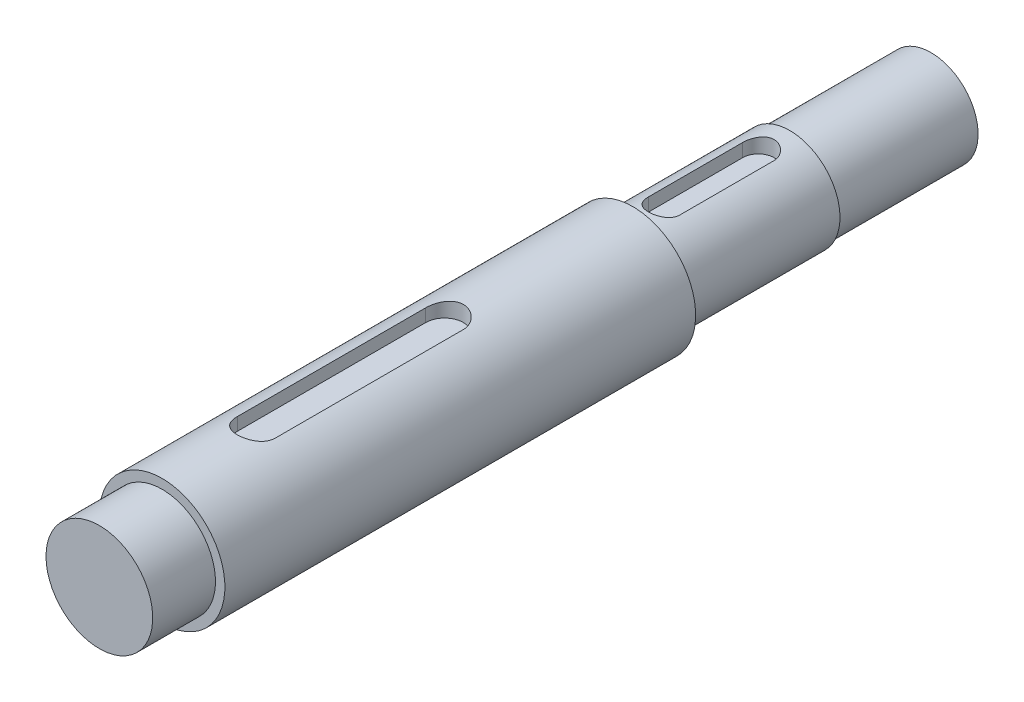
ISO-10303-21;
HEADER;
FILE_DESCRIPTION(('STEP AP214'),'2;1');
FILE_NAME('part.step','',(''),(''),'','','');
FILE_SCHEMA(('AUTOMOTIVE_DESIGN { 1 0 10303 214 1 1 1 1 }'));
ENDSEC;
DATA;
#1=APPLICATION_CONTEXT('core data for automotive mechanical design processes');
#2=APPLICATION_PROTOCOL_DEFINITION('international standard','automotive_design',2000,#1);
#3=PRODUCT_CONTEXT('',#1,'mechanical');
#4=PRODUCT('Part','Part','',(#3));
#5=PRODUCT_RELATED_PRODUCT_CATEGORY('part','',(#4));
#6=PRODUCT_DEFINITION_FORMATION('','',#4);
#7=PRODUCT_DEFINITION_CONTEXT('part definition',#1,'design');
#8=PRODUCT_DEFINITION('design','',#6,#7);
#9=PRODUCT_DEFINITION_SHAPE('','',#8);
#10=(LENGTH_UNIT() NAMED_UNIT(*) SI_UNIT(.MILLI.,.METRE.));
#11=(NAMED_UNIT(*) PLANE_ANGLE_UNIT() SI_UNIT($,.RADIAN.));
#12=(NAMED_UNIT(*) SI_UNIT($,.STERADIAN.) SOLID_ANGLE_UNIT());
#13=UNCERTAINTY_MEASURE_WITH_UNIT(LENGTH_MEASURE(1.E-05),#10,'distance_accuracy_value','');
#14=(GEOMETRIC_REPRESENTATION_CONTEXT(3) GLOBAL_UNCERTAINTY_ASSIGNED_CONTEXT((#13)) GLOBAL_UNIT_ASSIGNED_CONTEXT((#10,
#11,#12)) REPRESENTATION_CONTEXT('',''));
#15=CARTESIAN_POINT('',(0.,0.,0.));
#16=DIRECTION('',(0.,0.,1.));
#17=DIRECTION('',(1.,0.,0.));
#18=AXIS2_PLACEMENT_3D('',#15,#16,#17);
#19=CARTESIAN_POINT('',(0.,0.,0.));
#20=DIRECTION('',(0.,0.,-1.));
#21=DIRECTION('',(-1.,0.,0.));
#22=AXIS2_PLACEMENT_3D('',#19,#20,#21);
#23=CYLINDRICAL_SURFACE('',#22,20.);
#24=CARTESIAN_POINT('',(0.,0.,95.));
#25=DIRECTION('',(0.,0.,-1.));
#26=DIRECTION('',(-1.,0.,0.));
#27=AXIS2_PLACEMENT_3D('',#24,#25,#26);
#28=CIRCLE('',#27,20.);
#29=CARTESIAN_POINT('',(-20.,0.,95.));
#30=VERTEX_POINT('',#29);
#31=EDGE_CURVE('E162',#30,#30,#28,.T.);
#32=ORIENTED_EDGE('',*,*,#31,.F.);
#33=EDGE_LOOP('',(#32));
#34=FACE_BOUND('',#33,.T.);
#35=CARTESIAN_POINT('',(0.,0.,245.));
#36=DIRECTION('',(0.,0.,-1.));
#37=DIRECTION('',(-1.,0.,0.));
#38=AXIS2_PLACEMENT_3D('',#35,#36,#37);
#39=CIRCLE('',#38,20.);
#40=CARTESIAN_POINT('',(-20.,0.,245.));
#41=VERTEX_POINT('',#40);
#42=EDGE_CURVE('E165',#41,#41,#39,.T.);
#43=ORIENTED_EDGE('',*,*,#42,.T.);
#44=EDGE_LOOP('',(#43));
#45=FACE_BOUND('',#44,.T.);
#46=CARTESIAN_POINT('',(6.00000000000017,19.0787840283389,155.));
#47=CARTESIAN_POINT('',(6.00002230630971,19.0787603919218,154.835332005089));
#48=CARTESIAN_POINT('',(5.99322212828878,19.0809150948053,154.67067261307));
#49=CARTESIAN_POINT('',(5.96614198358455,19.089408588524,154.342610571615));
#50=CARTESIAN_POINT('',(5.94586504749999,19.0957464386677,154.179207647986));
#51=CARTESIAN_POINT('',(5.89206455668675,19.1124126760414,153.855233206316));
#52=CARTESIAN_POINT('',(5.85857463708954,19.1227309292375,153.694655572036));
#53=CARTESIAN_POINT('',(5.77865096251394,19.1470349488515,153.377037691332));
#54=CARTESIAN_POINT('',(5.73221686903448,19.16102081118,153.219997537531));
#55=CARTESIAN_POINT('',(5.62682620459501,19.1922338155173,152.910617439276));
#56=CARTESIAN_POINT('',(5.5678770245257,19.2094590438082,152.758274781224));
#57=CARTESIAN_POINT('',(5.43788252899642,19.2466621419291,152.459125857098));
#58=CARTESIAN_POINT('',(5.36683271334074,19.2666410353108,152.312321675672));
#59=CARTESIAN_POINT('',(5.21317247195212,19.3087849542851,152.025215054747));
#60=CARTESIAN_POINT('',(5.1305613960985,19.3309501027959,151.88491298147));
#61=CARTESIAN_POINT('',(4.95431913401991,19.3768680311909,151.611612201325));
#62=CARTESIAN_POINT('',(4.86068378223789,19.4006214097184,151.478616283128));
#63=CARTESIAN_POINT('',(4.66024014290241,19.4497584548899,151.21713642677));
#64=CARTESIAN_POINT('',(4.55313526362707,19.4751691904068,151.088884847802));
#65=CARTESIAN_POINT('',(4.32860344600283,19.5263015189751,150.841746062991));
#66=CARTESIAN_POINT('',(4.21117292654735,19.5520232171847,150.722862133329));
#67=CARTESIAN_POINT('',(3.96676059198608,19.6030710031715,150.495258604878));
#68=CARTESIAN_POINT('',(3.83977871873954,19.6283970885393,150.386539067971));
#69=CARTESIAN_POINT('',(3.57705696576226,19.6779706962222,150.179980745528));
#70=CARTESIAN_POINT('',(3.44131715512985,19.7022182270443,150.082141874161));
#71=CARTESIAN_POINT('',(3.15899953964094,19.7494715734221,149.89609023174));
#72=CARTESIAN_POINT('',(3.01225429870671,19.7724407517412,149.808121953698));
#73=CARTESIAN_POINT('',(2.71155717798069,19.8159158974823,149.644936205945));
#74=CARTESIAN_POINT('',(2.55760798995113,19.8364227748921,149.569714021433));
#75=CARTESIAN_POINT('',(2.24348996032498,19.8744001644265,149.432583560629));
#76=CARTESIAN_POINT('',(2.08331997555635,19.8918701152059,149.370677745232));
#77=CARTESIAN_POINT('',(1.75801430484789,19.923254535561,149.260762497544));
#78=CARTESIAN_POINT('',(1.59288079897405,19.9371705413066,149.212747060032));
#79=CARTESIAN_POINT('',(1.26354510595591,19.960709769643,149.132174453272));
#80=CARTESIAN_POINT('',(1.09944808925095,19.9704430293701,149.099219373042));
#81=CARTESIAN_POINT('',(0.768952154149116,19.9858966495547,149.047128002714));
#82=CARTESIAN_POINT('',(0.602554181799461,19.9916186120195,149.027986195865));
#83=CARTESIAN_POINT('',(0.268644299740396,19.9988929276978,149.003680035143));
#84=CARTESIAN_POINT('',(0.101132356361144,20.0004451543013,148.998516105694));
#85=CARTESIAN_POINT('',(-0.23372090041069,19.9993350985709,149.002216405078));
#86=CARTESIAN_POINT('',(-0.401062216878332,19.9966728935832,149.011080376463));
#87=CARTESIAN_POINT('',(-0.728949940400138,19.9873626800315,149.042242211602));
#88=CARTESIAN_POINT('',(-0.889542117296485,19.9808452710305,149.064100009983));
#89=CARTESIAN_POINT('',(-1.20830021014889,19.9641050678088,149.120695481758));
#90=CARTESIAN_POINT('',(-1.36646528055398,19.9538810115069,149.155437542225));
#91=CARTESIAN_POINT('',(-1.67917461818921,19.9300014175933,149.23749230161));
#92=CARTESIAN_POINT('',(-1.83372008335715,19.916347033335,149.284800775723));
#93=CARTESIAN_POINT('',(-2.13828018933718,19.8859545815151,149.391630271063));
#94=CARTESIAN_POINT('',(-2.28829310223854,19.8692153547843,149.451155883997));
#95=CARTESIAN_POINT('',(-2.58443507880925,19.8328818557961,149.582690579539));
#96=CARTESIAN_POINT('',(-2.73050124822103,19.8132575095083,149.654832897198));
#97=CARTESIAN_POINT('',(-3.01609632375403,19.7717979578185,149.810623147329));
#98=CARTESIAN_POINT('',(-3.15562296424223,19.7499619943592,149.894275028384));
#99=CARTESIAN_POINT('',(-3.42724384686874,19.704643118031,150.072486982441));
#100=CARTESIAN_POINT('',(-3.55933800314009,19.681160186142,150.167047181428));
#101=CARTESIAN_POINT('',(-3.81531376455338,19.6331439703208,150.366458678429));
#102=CARTESIAN_POINT('',(-3.93919513006467,19.6086106557752,150.471310276501));
#103=CARTESIAN_POINT('',(-4.18263653591635,19.5581593507452,150.694897243463));
#104=CARTESIAN_POINT('',(-4.30184428600917,19.5322244988475,150.814012679474));
#105=CARTESIAN_POINT('',(-4.52981041510251,19.4806179410543,151.061833503502));
#106=CARTESIAN_POINT('',(-4.63857214120799,19.4549461532391,151.190535796081));
#107=CARTESIAN_POINT('',(-4.84504126060948,19.4045581786368,151.456840396238));
#108=CARTESIAN_POINT('',(-4.94274124635215,19.3798426394128,151.594448571901));
#109=CARTESIAN_POINT('',(-5.12628631686307,19.3321023379675,151.877559092333));
#110=CARTESIAN_POINT('',(-5.21213600998861,19.3090769201298,152.023058337578));
#111=CARTESIAN_POINT('',(-5.3722308036755,19.2651525602886,152.322635135093));
#112=CARTESIAN_POINT('',(-5.44634371437385,19.2442786555292,152.476787078659));
#113=CARTESIAN_POINT('',(-5.58122691640486,19.205593723789,152.791121841361));
#114=CARTESIAN_POINT('',(-5.64200266456187,19.1877814448102,152.951302162478));
#115=CARTESIAN_POINT('',(-5.74966145349615,19.1557967477957,153.27643211835));
#116=CARTESIAN_POINT('',(-5.7965591282547,19.1416204978024,153.441376526563));
#117=CARTESIAN_POINT('',(-5.87609462586421,19.1173543231183,153.774893180451));
#118=CARTESIAN_POINT('',(-5.9087390260436,19.1072625137755,153.943463715048));
#119=CARTESIAN_POINT('',(-5.95603131732384,19.0925703406669,154.259937070236));
#120=CARTESIAN_POINT('',(-5.97251971262409,19.0874107715083,154.40754170936));
#121=CARTESIAN_POINT('',(-5.99450261914139,19.0805126306353,154.703427112475));
#122=CARTESIAN_POINT('',(-6.00001329545491,19.0787690288454,154.851706559575));
#123=CARTESIAN_POINT('',(-5.99999999999983,19.078784028339,155.));
#124=B_SPLINE_CURVE_WITH_KNOTS('',3,(#46,#47,#48,#49,#50,#51,#52,#53,#54,#55,#56,#57,#58,#59,
#60,#61,#62,#63,#64,#65,#66,#67,#68,#69,#70,#71,#72,#73,#74,#75,#76,#77,#78,#79,#80,#81,#82,#83,
#84,#85,#86,#87,#88,#89,#90,#91,#92,#93,#94,#95,#96,#97,#98,#99,#100,#101,#102,#103,#104,#105,
#106,#107,#108,#109,#110,#111,#112,#113,#114,#115,#116,#117,#118,#119,#120,#121,#122,#123),
.UNSPECIFIED.,.F.,.F.,(4,2,2,2,2,2,2,2,2,2,2,2,2,2,2,2,2,2,2,2,2,2,2,2,2,2,2,2,2,2,2,2,2,2,2,2,
2,2,4),(0.,0.493836284878976,0.987561555412216,1.48003801924605,1.97252736296405,
2.46472666795178,2.95710942192586,3.44951987503682,3.94211698773,4.44857898474592,
4.95521732942468,5.46185875834847,5.96849619046396,6.48574341264193,7.00279888450885,
7.51994982748061,8.03687685551445,8.53921958328379,9.04136157401789,9.5435188116382,
10.0456668334346,10.531706521874,11.0179118582603,11.5039539397552,11.9901790315928,
12.4818885441265,12.9737671698834,13.4656514771114,13.9575501300996,14.4684682486943,
14.9792221093922,15.4903160010787,16.001210574562,16.5175029344931,17.0335836608614,
17.549118241575,18.0644146711719,18.509813123396,18.9545552237083),.UNSPECIFIED.);
#125=CARTESIAN_POINT('',(6.00000000000017,19.0787840283389,155.));
#126=VERTEX_POINT('',#125);
#127=CARTESIAN_POINT('',(-5.99999999999983,19.078784028339,155.));
#128=VERTEX_POINT('',#127);
#129=EDGE_CURVE('E214',#126,#128,#124,.T.);
#130=ORIENTED_EDGE('',*,*,#129,.F.);
#131=DIRECTION('',(0.,0.,-1.));
#132=VECTOR('',#131,1.);
#133=CARTESIAN_POINT('',(6.00000000000017,19.0787840283389,0.));
#134=LINE('',#133,#132);
#135=CARTESIAN_POINT('',(6.00000000000017,19.0787840283389,215.));
#136=VERTEX_POINT('',#135);
#137=EDGE_CURVE('E11',#136,#126,#134,.T.);
#138=ORIENTED_EDGE('',*,*,#137,.F.);
#139=CARTESIAN_POINT('',(-5.99999999999983,19.078784028339,215.));
#140=CARTESIAN_POINT('',(-6.00002230630936,19.0787603919219,215.164667994911));
#141=CARTESIAN_POINT('',(-5.99322212828844,19.0809150948054,215.32932738693));
#142=CARTESIAN_POINT('',(-5.96614198358421,19.0894085885241,215.657389428385));
#143=CARTESIAN_POINT('',(-5.94586504749965,19.0957464386678,215.820792352014));
#144=CARTESIAN_POINT('',(-5.89206455668642,19.1124126760415,216.144766793684));
#145=CARTESIAN_POINT('',(-5.8585746370892,19.1227309292376,216.305344427964));
#146=CARTESIAN_POINT('',(-5.7786509625136,19.1470349488516,216.622962308668));
#147=CARTESIAN_POINT('',(-5.73221686903414,19.1610208111801,216.780002462469));
#148=CARTESIAN_POINT('',(-5.62682620459467,19.1922338155173,217.089382560724));
#149=CARTESIAN_POINT('',(-5.56787702452536,19.2094590438083,217.241725218776));
#150=CARTESIAN_POINT('',(-5.43788252899608,19.2466621419291,217.540874142902));
#151=CARTESIAN_POINT('',(-5.36683271334041,19.2666410353109,217.687678324328));
#152=CARTESIAN_POINT('',(-5.21317247195179,19.3087849542852,217.974784945253));
#153=CARTESIAN_POINT('',(-5.13056139609817,19.330950102796,218.11508701853));
#154=CARTESIAN_POINT('',(-4.95431913401957,19.3768680311909,218.388387798675));
#155=CARTESIAN_POINT('',(-4.86068378223755,19.4006214097185,218.521383716872));
#156=CARTESIAN_POINT('',(-4.66024014290207,19.44975845489,218.78286357323));
#157=CARTESIAN_POINT('',(-4.55313526362673,19.4751691904069,218.911115152198));
#158=CARTESIAN_POINT('',(-4.32860344600248,19.5263015189752,219.158253937009));
#159=CARTESIAN_POINT('',(-4.21117292654701,19.5520232171848,219.277137866671));
#160=CARTESIAN_POINT('',(-3.96676059198573,19.6030710031715,219.504741395122));
#161=CARTESIAN_POINT('',(-3.83977871873919,19.6283970885394,219.613460932029));
#162=CARTESIAN_POINT('',(-3.57705696576191,19.6779706962223,219.820019254472));
#163=CARTESIAN_POINT('',(-3.44131715512949,19.7022182270444,219.917858125839));
#164=CARTESIAN_POINT('',(-3.15899953964057,19.7494715734221,220.10390976826));
#165=CARTESIAN_POINT('',(-3.01225429870634,19.7724407517413,220.191878046302));
#166=CARTESIAN_POINT('',(-2.71155717798033,19.8159158974823,220.355063794055));
#167=CARTESIAN_POINT('',(-2.55760798995078,19.8364227748921,220.430285978567));
#168=CARTESIAN_POINT('',(-2.24348996032463,19.8744001644266,220.567416439371));
#169=CARTESIAN_POINT('',(-2.083319975556,19.8918701152059,220.629322254768));
#170=CARTESIAN_POINT('',(-1.75801430484754,19.9232545355611,220.739237502456));
#171=CARTESIAN_POINT('',(-1.59288079897371,19.9371705413066,220.787252939968));
#172=CARTESIAN_POINT('',(-1.26354510595557,19.960709769643,220.867825546728));
#173=CARTESIAN_POINT('',(-1.09944808925061,19.9704430293702,220.900780626958));
#174=CARTESIAN_POINT('',(-0.76895215414877,19.9858966495547,220.952871997286));
#175=CARTESIAN_POINT('',(-0.602554181799117,19.9916186120196,220.972013804135));
#176=CARTESIAN_POINT('',(-0.268644299740054,19.9988929276978,220.996319964857));
#177=CARTESIAN_POINT('',(-0.1011323563608,20.0004451543013,221.001483894306));
#178=CARTESIAN_POINT('',(0.233720900411035,19.9993350985709,220.997783594922));
#179=CARTESIAN_POINT('',(0.401062216878677,19.9966728935831,220.988919623537));
#180=CARTESIAN_POINT('',(0.72894994040048,19.9873626800315,220.957757788398));
#181=CARTESIAN_POINT('',(0.889542117296824,19.9808452710305,220.935899990017));
#182=CARTESIAN_POINT('',(1.20830021014923,19.9641050678088,220.879304518242));
#183=CARTESIAN_POINT('',(1.36646528055431,19.9538810115069,220.844562457775));
#184=CARTESIAN_POINT('',(1.67917461818955,19.9300014175933,220.76250769839));
#185=CARTESIAN_POINT('',(1.83372008335749,19.916347033335,220.715199224277));
#186=CARTESIAN_POINT('',(2.13828018933751,19.885954581515,220.608369728937));
#187=CARTESIAN_POINT('',(2.28829310223887,19.8692153547843,220.548844116003));
#188=CARTESIAN_POINT('',(2.58443507880958,19.8328818557961,220.417309420461));
#189=CARTESIAN_POINT('',(2.73050124822137,19.8132575095082,220.345167102802));
#190=CARTESIAN_POINT('',(3.01609632375437,19.7717979578185,220.189376852671));
#191=CARTESIAN_POINT('',(3.15562296424257,19.7499619943591,220.105724971616));
#192=CARTESIAN_POINT('',(3.42724384686907,19.704643118031,219.927513017559));
#193=CARTESIAN_POINT('',(3.55933800314043,19.6811601861419,219.832952818572));
#194=CARTESIAN_POINT('',(3.81531376455373,19.6331439703208,219.633541321571));
#195=CARTESIAN_POINT('',(3.93919513006501,19.6086106557752,219.528689723499));
#196=CARTESIAN_POINT('',(4.18263653591669,19.5581593507451,219.305102756537));
#197=CARTESIAN_POINT('',(4.30184428600951,19.5322244988474,219.185987320526));
#198=CARTESIAN_POINT('',(4.52981041510285,19.4806179410542,218.938166496498));
#199=CARTESIAN_POINT('',(4.63857214120832,19.454946153239,218.809464203919));
#200=CARTESIAN_POINT('',(4.84504126060982,19.4045581786367,218.543159603762));
#201=CARTESIAN_POINT('',(4.94274124635249,19.3798426394128,218.405551428099));
#202=CARTESIAN_POINT('',(5.12628631686341,19.3321023379674,218.122440907667));
#203=CARTESIAN_POINT('',(5.21213600998894,19.3090769201297,217.976941662422));
#204=CARTESIAN_POINT('',(5.37223080367583,19.2651525602885,217.677364864907));
#205=CARTESIAN_POINT('',(5.44634371437418,19.2442786555291,217.523212921341));
#206=CARTESIAN_POINT('',(5.58122691640519,19.2055937237889,217.208878158639));
#207=CARTESIAN_POINT('',(5.6420026645622,19.1877814448102,217.048697837522));
#208=CARTESIAN_POINT('',(5.74966145349648,19.1557967477956,216.72356788165));
#209=CARTESIAN_POINT('',(5.79655912825504,19.1416204978023,216.558623473437));
#210=CARTESIAN_POINT('',(5.87609462586455,19.1173543231182,216.225106819549));
#211=CARTESIAN_POINT('',(5.90873902604394,19.1072625137754,216.056536284952));
#212=CARTESIAN_POINT('',(5.95603131732418,19.0925703406668,215.740062929764));
#213=CARTESIAN_POINT('',(5.97251971262442,19.0874107715082,215.59245829064));
#214=CARTESIAN_POINT('',(5.99450261914172,19.0805126306352,215.296572887525));
#215=CARTESIAN_POINT('',(6.00001329545525,19.0787690288453,215.148293440425));
#216=CARTESIAN_POINT('',(6.00000000000017,19.0787840283389,215.));
#217=B_SPLINE_CURVE_WITH_KNOTS('',3,(#139,#140,#141,#142,#143,#144,#145,#146,#147,#148,#149,
#150,#151,#152,#153,#154,#155,#156,#157,#158,#159,#160,#161,#162,#163,#164,#165,#166,#167,#168,
#169,#170,#171,#172,#173,#174,#175,#176,#177,#178,#179,#180,#181,#182,#183,#184,#185,#186,#187,
#188,#189,#190,#191,#192,#193,#194,#195,#196,#197,#198,#199,#200,#201,#202,#203,#204,#205,#206,
#207,#208,#209,#210,#211,#212,#213,#214,#215,#216),.UNSPECIFIED.,.F.,.F.,(4,2,2,2,2,2,2,2,2,2,2,
2,2,2,2,2,2,2,2,2,2,2,2,2,2,2,2,2,2,2,2,2,2,2,2,2,2,2,4),(0.,0.493836284878976,
0.987561555412215,1.48003801924605,1.97252736296405,2.46472666795178,2.95710942192586,
3.44951987503682,3.94211698772999,4.44857898474592,4.95521732942468,5.46185875834849,
5.96849619046399,6.48574341264197,7.00279888450886,7.51994982748061,8.03687685551445,
8.5392195832838,9.0413615740179,9.54351881163821,10.0456668334346,10.531706521874,
11.0179118582603,11.5039539397551,11.9901790315928,12.4818885441265,12.9737671698834,
13.4656514771114,13.9575501300996,14.4684682486943,14.9792221093922,15.4903160010787,
16.001210574562,16.517502934493,17.0335836608614,17.5491182415751,18.0644146711719,
18.509813123396,18.9545552237083),.UNSPECIFIED.);
#218=CARTESIAN_POINT('',(-5.99999999999983,19.078784028339,215.));
#219=VERTEX_POINT('',#218);
#220=EDGE_CURVE('E47',#219,#136,#217,.T.);
#221=ORIENTED_EDGE('',*,*,#220,.F.);
#222=DIRECTION('',(0.,0.,-1.));
#223=VECTOR('',#222,1.);
#224=CARTESIAN_POINT('',(-5.99999999999983,19.078784028339,0.));
#225=LINE('',#224,#223);
#226=EDGE_CURVE('E124',#128,#219,#225,.F.);
#227=ORIENTED_EDGE('',*,*,#226,.F.);
#228=EDGE_LOOP('',(#130,#138,#221,#227));
#229=FACE_BOUND('',#228,.T.);
#230=ADVANCED_FACE('F39',(#34,#45,#229),#23,.T.);
#231=CARTESIAN_POINT('',(0.,0.,0.));
#232=DIRECTION('',(0.,0.,-1.));
#233=DIRECTION('',(-1.,0.,0.));
#234=AXIS2_PLACEMENT_3D('',#231,#232,#233);
#235=CYLINDRICAL_SURFACE('',#234,16.);
#236=CARTESIAN_POINT('',(0.,0.,45.));
#237=DIRECTION('',(0.,0.,-1.));
#238=DIRECTION('',(-1.,0.,0.));
#239=AXIS2_PLACEMENT_3D('',#236,#237,#238);
#240=CIRCLE('',#239,16.);
#241=CARTESIAN_POINT('',(-16.,0.,45.));
#242=VERTEX_POINT('',#241);
#243=EDGE_CURVE('E156',#242,#242,#240,.T.);
#244=ORIENTED_EDGE('',*,*,#243,.F.);
#245=EDGE_LOOP('',(#244));
#246=FACE_BOUND('',#245,.T.);
#247=CARTESIAN_POINT('',(0.,0.,95.));
#248=DIRECTION('',(0.,0.,-1.));
#249=DIRECTION('',(-1.,0.,0.));
#250=AXIS2_PLACEMENT_3D('',#247,#248,#249);
#251=CIRCLE('',#250,16.);
#252=CARTESIAN_POINT('',(-16.,0.,95.));
#253=VERTEX_POINT('',#252);
#254=EDGE_CURVE('E159',#253,#253,#251,.T.);
#255=ORIENTED_EDGE('',*,*,#254,.T.);
#256=EDGE_LOOP('',(#255));
#257=FACE_BOUND('',#256,.T.);
#258=CARTESIAN_POINT('',(-4.99999999999999,15.1986841535707,85.));
#259=CARTESIAN_POINT('',(-5.00001876402017,15.1986635060155,85.1369297177379));
#260=CARTESIAN_POINT('',(-4.99437589347759,15.2005339376472,85.2738515786107));
#261=CARTESIAN_POINT('',(-4.9719066012981,15.2079058985265,85.5466441616811));
#262=CARTESIAN_POINT('',(-4.95508287500205,15.2134065526432,85.682515129231));
#263=CARTESIAN_POINT('',(-4.91045141983463,15.2278686056186,85.9518756253299));
#264=CARTESIAN_POINT('',(-4.88267328245064,15.2368206796073,86.0853705652593));
#265=CARTESIAN_POINT('',(-4.81639022533697,15.2579029145887,86.3494121913658));
#266=CARTESIAN_POINT('',(-4.77788498675235,15.2700331700498,86.479958789781));
#267=CARTESIAN_POINT('',(-4.6904983772981,15.2971014107057,86.7371387356005));
#268=CARTESIAN_POINT('',(-4.64162394412444,15.3120375178334,86.8637746349516));
#269=CARTESIAN_POINT('',(-4.53387888598119,15.3442856115609,87.1124230254503));
#270=CARTESIAN_POINT('',(-4.47500453795588,15.3615984825888,87.2344337738435));
#271=CARTESIAN_POINT('',(-4.28398711580931,15.4163884767029,87.5923890679799));
#272=CARTESIAN_POINT('',(-4.13740351463561,15.4567319869187,87.8203916857904));
#273=CARTESIAN_POINT('',(-3.80477014396878,15.5420083062615,88.2559520827829));
#274=CARTESIAN_POINT('',(-3.61763914961477,15.5870445200358,88.4626585082762));
#275=CARTESIAN_POINT('',(-3.21145982301366,15.6757673694125,88.8423676526894));
#276=CARTESIAN_POINT('',(-2.99240601054463,15.7194537717275,89.0153645727234));
#277=CARTESIAN_POINT('',(-2.52249761762138,15.8017432610087,89.3264503978222));
#278=CARTESIAN_POINT('',(-2.27103576512447,15.8402090039263,89.4636611267965));
#279=CARTESIAN_POINT('',(-1.74720631304674,15.9065031203034,89.6935071381779));
#280=CARTESIAN_POINT('',(-1.47484448775401,15.9343344192537,89.7861546815474));
#281=CARTESIAN_POINT('',(-0.925860089211036,15.9754868433124,89.921404023007));
#282=CARTESIAN_POINT('',(-0.649628435012763,15.989229278753,89.9654621090382));
#283=CARTESIAN_POINT('',(-0.0933690149137086,16.0021438524195,90.0068974314688));
#284=CARTESIAN_POINT('',(0.186657953048535,16.0013190072522,90.0042843325814));
#285=CARTESIAN_POINT('',(0.73229958954639,15.9854845726588,89.9534065239998));
#286=CARTESIAN_POINT('',(0.998078033880914,15.9709657627342,89.9067212697878));
#287=CARTESIAN_POINT('',(1.51781473163232,15.9299791073477,89.7716196828297));
#288=CARTESIAN_POINT('',(1.77177234876053,15.90351061948,89.6832011065194));
#289=CARTESIAN_POINT('',(2.26431537219272,15.8409378140145,89.4661161738423));
#290=CARTESIAN_POINT('',(2.50267435181536,15.8047194262738,89.3369700371082));
#291=CARTESIAN_POINT('',(2.95480608942299,15.7264700104951,89.0425232216915));
#292=CARTESIAN_POINT('',(3.16857286940456,15.6844375745929,88.8772137804566));
#293=CARTESIAN_POINT('',(3.57495597883695,15.5969449434458,88.5068863322796));
#294=CARTESIAN_POINT('',(3.76632311133059,15.5514148920094,88.3005029256288));
#295=CARTESIAN_POINT('',(4.02553989626261,15.4855747041344,87.9689743734189));
#296=CARTESIAN_POINT('',(4.10735324144972,15.464023127535,87.8547196773283));
#297=CARTESIAN_POINT('',(4.2611738972957,15.4223452821405,87.6195614218215));
#298=CARTESIAN_POINT('',(4.33318503733556,15.4022184582275,87.4986604849243));
#299=CARTESIAN_POINT('',(4.4676837074109,15.3637482945825,87.2494667746369));
#300=CARTESIAN_POINT('',(4.53004475183007,15.3454296242414,87.1211019815447));
#301=CARTESIAN_POINT('',(4.64365087484839,15.3114343470153,86.8592633981691));
#302=CARTESIAN_POINT('',(4.69490052987993,15.2957566529907,86.7257917379939));
#303=CARTESIAN_POINT('',(4.78581076137362,15.2675565411669,86.4547920818445));
#304=CARTESIAN_POINT('',(4.82548366541209,15.2550307689955,86.3172685736427));
#305=CARTESIAN_POINT('',(4.89292357731496,15.2335336556112,86.039118633416));
#306=CARTESIAN_POINT('',(4.92069605575215,15.2245606813372,85.8984936584496));
#307=CARTESIAN_POINT('',(4.96155201839677,15.2112927618778,85.6316869336986));
#308=CARTESIAN_POINT('',(4.97596872830392,15.2065749583153,85.5057286808262));
#309=CARTESIAN_POINT('',(4.9951923004764,15.2002655216957,85.2531834848566));
#310=CARTESIAN_POINT('',(5.00001273345968,15.1986694740171,85.1265976837225));
#311=CARTESIAN_POINT('',(5.00000000000001,15.1986841535707,85.));
#312=B_SPLINE_CURVE_WITH_KNOTS('',3,(#258,#259,#260,#261,#262,#263,#264,#265,#266,#267,#268,
#269,#270,#271,#272,#273,#274,#275,#276,#277,#278,#279,#280,#281,#282,#283,#284,#285,#286,#287,
#288,#289,#290,#291,#292,#293,#294,#295,#296,#297,#298,#299,#300,#301,#302,#303,#304,#305,#306,
#307,#308,#309,#310,#311),.UNSPECIFIED.,.F.,.F.,(4,2,2,2,2,2,2,2,2,2,2,2,2,2,2,2,2,2,2,2,2,2,2,
2,2,2,4),(0.,0.410647919758036,0.821196881542661,1.2306443292275,1.64010394872541,
2.04929047101912,2.45862967230993,3.2768827913103,4.12046514534441,4.96419248897059,
5.827005743272,6.68958147010311,7.52553600517323,8.36131743199139,9.16823951381226,
9.97520498033131,10.7920560572179,11.609105280929,12.4601312020614,12.8862315051731,
13.3121648650028,13.7432787284905,14.1742146909751,14.604690079864,15.0349673682784,
15.4151752920152,15.7948451560185),.UNSPECIFIED.);
#313=CARTESIAN_POINT('',(-4.99999999999999,15.1986841535707,85.));
#314=VERTEX_POINT('',#313);
#315=CARTESIAN_POINT('',(5.00000000000001,15.1986841535707,85.));
#316=VERTEX_POINT('',#315);
#317=EDGE_CURVE('E174',#314,#316,#312,.T.);
#318=ORIENTED_EDGE('',*,*,#317,.F.);
#319=DIRECTION('',(0.,0.,-1.));
#320=VECTOR('',#319,1.);
#321=CARTESIAN_POINT('',(-4.99999999999999,15.1986841535707,0.));
#322=LINE('',#321,#320);
#323=CARTESIAN_POINT('',(-4.99999999999999,15.1986841535707,55.));
#324=VERTEX_POINT('',#323);
#325=EDGE_CURVE('E212',#324,#314,#322,.F.);
#326=ORIENTED_EDGE('',*,*,#325,.F.);
#327=CARTESIAN_POINT('',(5.00000000000001,15.1986841535707,55.));
#328=CARTESIAN_POINT('',(5.00001876402019,15.1986635060155,54.8630702822621));
#329=CARTESIAN_POINT('',(4.9943758934776,15.2005339376472,54.7261484213893));
#330=CARTESIAN_POINT('',(4.97190660129811,15.2079058985265,54.4533558383188));
#331=CARTESIAN_POINT('',(4.95508287500207,15.2134065526432,54.3174848707689));
#332=CARTESIAN_POINT('',(4.91045141983464,15.2278686056186,54.0481243746701));
#333=CARTESIAN_POINT('',(4.88267328245065,15.2368206796073,53.9146294347407));
#334=CARTESIAN_POINT('',(4.81639022533698,15.2579029145887,53.6505878086342));
#335=CARTESIAN_POINT('',(4.77788498675236,15.2700331700498,53.520041210219));
#336=CARTESIAN_POINT('',(4.69049837729812,15.2971014107057,53.2628612643995));
#337=CARTESIAN_POINT('',(4.64162394412446,15.3120375178334,53.1362253650484));
#338=CARTESIAN_POINT('',(4.53387888598121,15.3442856115609,52.8875769745497));
#339=CARTESIAN_POINT('',(4.4750045379559,15.3615984825888,52.7655662261564));
#340=CARTESIAN_POINT('',(4.28398711580933,15.4163884767029,52.4076109320201));
#341=CARTESIAN_POINT('',(4.13740351463562,15.4567319869187,52.1796083142096));
#342=CARTESIAN_POINT('',(3.80477014396879,15.5420083062615,51.7440479172171));
#343=CARTESIAN_POINT('',(3.61763914961479,15.5870445200358,51.5373414917237));
#344=CARTESIAN_POINT('',(3.21145982301369,15.6757673694125,51.1576323473105));
#345=CARTESIAN_POINT('',(2.99240601054465,15.7194537717275,50.9846354272766));
#346=CARTESIAN_POINT('',(2.5224976176214,15.8017432610087,50.6735496021778));
#347=CARTESIAN_POINT('',(2.2710357651245,15.8402090039263,50.5363388732035));
#348=CARTESIAN_POINT('',(1.74720631304677,15.9065031203034,50.3064928618221));
#349=CARTESIAN_POINT('',(1.47484448775404,15.9343344192537,50.2138453184526));
#350=CARTESIAN_POINT('',(0.925860089211065,15.9754868433124,50.078595976993));
#351=CARTESIAN_POINT('',(0.64962843501279,15.989229278753,50.0345378909617));
#352=CARTESIAN_POINT('',(0.0933690149137325,16.0021438524195,49.9931025685312));
#353=CARTESIAN_POINT('',(-0.186657953048512,16.0013190072522,49.9957156674186));
#354=CARTESIAN_POINT('',(-0.732299589546367,15.9854845726588,50.0465934760002));
#355=CARTESIAN_POINT('',(-0.998078033880891,15.9709657627342,50.0932787302122));
#356=CARTESIAN_POINT('',(-1.5178147316323,15.9299791073477,50.2283803171703));
#357=CARTESIAN_POINT('',(-1.77177234876051,15.90351061948,50.3167988934806));
#358=CARTESIAN_POINT('',(-2.2643153721927,15.8409378140145,50.5338838261577));
#359=CARTESIAN_POINT('',(-2.50267435181535,15.8047194262738,50.6630299628918));
#360=CARTESIAN_POINT('',(-2.95480608942298,15.7264700104951,50.9574767783085));
#361=CARTESIAN_POINT('',(-3.16857286940455,15.6844375745929,51.1227862195434));
#362=CARTESIAN_POINT('',(-3.57495597883694,15.5969449434458,51.4931136677204));
#363=CARTESIAN_POINT('',(-3.76632311133058,15.5514148920094,51.6994970743711));
#364=CARTESIAN_POINT('',(-4.0255398962626,15.4855747041344,52.0310256265811));
#365=CARTESIAN_POINT('',(-4.10735324144971,15.464023127535,52.1452803226716));
#366=CARTESIAN_POINT('',(-4.26117389729569,15.4223452821405,52.3804385781784));
#367=CARTESIAN_POINT('',(-4.33318503733555,15.4022184582275,52.5013395150756));
#368=CARTESIAN_POINT('',(-4.46768370741089,15.3637482945824,52.750533225363));
#369=CARTESIAN_POINT('',(-4.53004475183006,15.3454296242414,52.8788980184553));
#370=CARTESIAN_POINT('',(-4.64365087484838,15.3114343470153,53.1407366018309));
#371=CARTESIAN_POINT('',(-4.69490052987992,15.2957566529907,53.2742082620061));
#372=CARTESIAN_POINT('',(-4.78581076137361,15.2675565411669,53.5452079181555));
#373=CARTESIAN_POINT('',(-4.82548366541208,15.2550307689955,53.6827314263573));
#374=CARTESIAN_POINT('',(-4.89292357731495,15.2335336556112,53.960881366584));
#375=CARTESIAN_POINT('',(-4.92069605575213,15.2245606813372,54.1015063415504));
#376=CARTESIAN_POINT('',(-4.96155201839675,15.2112927618778,54.3683130663014));
#377=CARTESIAN_POINT('',(-4.97596872830391,15.2065749583153,54.4942713191738));
#378=CARTESIAN_POINT('',(-4.99519230047639,15.2002655216957,54.7468165151434));
#379=CARTESIAN_POINT('',(-5.00001273345967,15.1986694740171,54.8734023162774));
#380=CARTESIAN_POINT('',(-4.99999999999999,15.1986841535707,55.));
#381=B_SPLINE_CURVE_WITH_KNOTS('',3,(#327,#328,#329,#330,#331,#332,#333,#334,#335,#336,#337,
#338,#339,#340,#341,#342,#343,#344,#345,#346,#347,#348,#349,#350,#351,#352,#353,#354,#355,#356,
#357,#358,#359,#360,#361,#362,#363,#364,#365,#366,#367,#368,#369,#370,#371,#372,#373,#374,#375,
#376,#377,#378,#379,#380),.UNSPECIFIED.,.F.,.F.,(4,2,2,2,2,2,2,2,2,2,2,2,2,2,2,2,2,2,2,2,2,2,2,
2,2,2,4),(0.,0.410647919758043,0.821196881542668,1.23064432922752,1.64010394872541,
2.04929047101912,2.45862967230994,3.2768827913103,4.12046514534441,4.96419248897057,
5.82700574327198,6.68958147010309,7.52553600517321,8.36131743199138,9.16823951381225,
9.97520498033131,10.7920560572179,11.609105280929,12.4601312020614,12.8862315051731,
13.3121648650028,13.7432787284905,14.1742146909751,14.6046900798641,15.0349673682784,
15.4151752920152,15.7948451560185),.UNSPECIFIED.);
#382=CARTESIAN_POINT('',(5.00000000000001,15.1986841535707,55.));
#383=VERTEX_POINT('',#382);
#384=EDGE_CURVE('E206',#383,#324,#381,.T.);
#385=ORIENTED_EDGE('',*,*,#384,.F.);
#386=DIRECTION('',(0.,0.,-1.));
#387=VECTOR('',#386,1.);
#388=CARTESIAN_POINT('',(5.00000000000001,15.1986841535707,0.));
#389=LINE('',#388,#387);
#390=EDGE_CURVE('E182',#316,#383,#389,.T.);
#391=ORIENTED_EDGE('',*,*,#390,.F.);
#392=EDGE_LOOP('',(#318,#326,#385,#391));
#393=FACE_BOUND('',#392,.T.);
#394=ADVANCED_FACE('F184',(#246,#257,#393),#235,.T.);
#395=CARTESIAN_POINT('',(15.,0.,0.));
#396=DIRECTION('',(0.,0.,1.));
#397=DIRECTION('',(1.,0.,0.));
#398=AXIS2_PLACEMENT_3D('',#395,#396,#397);
#399=PLANE('',#398);
#400=CARTESIAN_POINT('',(0.,0.,0.));
#401=DIRECTION('',(0.,0.,-1.));
#402=DIRECTION('',(-1.,0.,0.));
#403=AXIS2_PLACEMENT_3D('',#400,#401,#402);
#404=CIRCLE('',#403,15.);
#405=CARTESIAN_POINT('',(-15.,0.,0.));
#406=VERTEX_POINT('',#405);
#407=EDGE_CURVE('E150',#406,#406,#404,.T.);
#408=ORIENTED_EDGE('',*,*,#407,.T.);
#409=EDGE_LOOP('',(#408));
#410=FACE_BOUND('',#409,.T.);
#411=ADVANCED_FACE('F41',(#410),#399,.F.);
#412=CARTESIAN_POINT('',(17.0000000000001,0.,265.));
#413=DIRECTION('',(0.,0.,-1.));
#414=DIRECTION('',(-1.,0.,0.));
#415=AXIS2_PLACEMENT_3D('',#412,#413,#414);
#416=PLANE('',#415);
#417=CARTESIAN_POINT('',(0.,0.,265.));
#418=DIRECTION('',(0.,0.,-1.));
#419=DIRECTION('',(-1.,0.,0.));
#420=AXIS2_PLACEMENT_3D('',#417,#418,#419);
#421=CIRCLE('',#420,17.);
#422=CARTESIAN_POINT('',(-17.,0.,265.));
#423=VERTEX_POINT('',#422);
#424=EDGE_CURVE('E171',#423,#423,#421,.T.);
#425=ORIENTED_EDGE('',*,*,#424,.F.);
#426=EDGE_LOOP('',(#425));
#427=FACE_BOUND('',#426,.T.);
#428=ADVANCED_FACE('F272',(#427),#416,.F.);
#429=CARTESIAN_POINT('',(0.,0.,0.));
#430=DIRECTION('',(0.,0.,-1.));
#431=DIRECTION('',(-1.,0.,0.));
#432=AXIS2_PLACEMENT_3D('',#429,#430,#431);
#433=CYLINDRICAL_SURFACE('',#432,17.);
#434=CARTESIAN_POINT('',(0.,0.,245.));
#435=DIRECTION('',(0.,0.,-1.));
#436=DIRECTION('',(-1.,0.,0.));
#437=AXIS2_PLACEMENT_3D('',#434,#435,#436);
#438=CIRCLE('',#437,17.);
#439=CARTESIAN_POINT('',(-17.,0.,245.));
#440=VERTEX_POINT('',#439);
#441=EDGE_CURVE('E168',#440,#440,#438,.T.);
#442=ORIENTED_EDGE('',*,*,#441,.F.);
#443=EDGE_LOOP('',(#442));
#444=FACE_BOUND('',#443,.T.);
#445=ORIENTED_EDGE('',*,*,#424,.T.);
#446=EDGE_LOOP('',(#445));
#447=FACE_BOUND('',#446,.T.);
#448=ADVANCED_FACE('F267',(#444,#447),#433,.T.);
#449=CARTESIAN_POINT('',(20.,0.,245.));
#450=DIRECTION('',(0.,0.,-1.));
#451=DIRECTION('',(-1.,0.,0.));
#452=AXIS2_PLACEMENT_3D('',#449,#450,#451);
#453=PLANE('',#452);
#454=ORIENTED_EDGE('',*,*,#42,.F.);
#455=EDGE_LOOP('',(#454));
#456=FACE_BOUND('',#455,.T.);
#457=ORIENTED_EDGE('',*,*,#441,.T.);
#458=EDGE_LOOP('',(#457));
#459=FACE_BOUND('',#458,.T.);
#460=ADVANCED_FACE('F263',(#456,#459),#453,.F.);
#461=CARTESIAN_POINT('',(16.,0.,95.));
#462=DIRECTION('',(0.,0.,1.));
#463=DIRECTION('',(1.,0.,0.));
#464=AXIS2_PLACEMENT_3D('',#461,#462,#463);
#465=PLANE('',#464);
#466=ORIENTED_EDGE('',*,*,#254,.F.);
#467=EDGE_LOOP('',(#466));
#468=FACE_BOUND('',#467,.T.);
#469=ORIENTED_EDGE('',*,*,#31,.T.);
#470=EDGE_LOOP('',(#469));
#471=FACE_BOUND('',#470,.T.);
#472=ADVANCED_FACE('F266',(#468,#471),#465,.F.);
#473=CARTESIAN_POINT('',(15.,0.,45.));
#474=DIRECTION('',(0.,0.,1.));
#475=DIRECTION('',(1.,0.,0.));
#476=AXIS2_PLACEMENT_3D('',#473,#474,#475);
#477=PLANE('',#476);
#478=CARTESIAN_POINT('',(0.,0.,45.));
#479=DIRECTION('',(0.,0.,-1.));
#480=DIRECTION('',(-1.,0.,0.));
#481=AXIS2_PLACEMENT_3D('',#478,#479,#480);
#482=CIRCLE('',#481,15.);
#483=CARTESIAN_POINT('',(-15.,0.,45.));
#484=VERTEX_POINT('',#483);
#485=EDGE_CURVE('E153',#484,#484,#482,.T.);
#486=ORIENTED_EDGE('',*,*,#485,.F.);
#487=EDGE_LOOP('',(#486));
#488=FACE_BOUND('',#487,.T.);
#489=ORIENTED_EDGE('',*,*,#243,.T.);
#490=EDGE_LOOP('',(#489));
#491=FACE_BOUND('',#490,.T.);
#492=ADVANCED_FACE('F287',(#488,#491),#477,.F.);
#493=CARTESIAN_POINT('',(0.,0.,0.));
#494=DIRECTION('',(0.,0.,-1.));
#495=DIRECTION('',(-1.,0.,0.));
#496=AXIS2_PLACEMENT_3D('',#493,#494,#495);
#497=CYLINDRICAL_SURFACE('',#496,15.);
#498=ORIENTED_EDGE('',*,*,#407,.F.);
#499=EDGE_LOOP('',(#498));
#500=FACE_BOUND('',#499,.T.);
#501=ORIENTED_EDGE('',*,*,#485,.T.);
#502=EDGE_LOOP('',(#501));
#503=FACE_BOUND('',#502,.T.);
#504=ADVANCED_FACE('F204',(#500,#503),#497,.T.);
#505=CARTESIAN_POINT('',(0.,11.,55.));
#506=DIRECTION('',(0.,1.,0.));
#507=DIRECTION('',(0.,0.,1.));
#508=AXIS2_PLACEMENT_3D('',#505,#506,#507);
#509=CYLINDRICAL_SURFACE('',#508,5.);
#510=DIRECTION('',(0.,1.,0.));
#511=VECTOR('',#510,1.);
#512=CARTESIAN_POINT('',(5.00000000000001,11.,55.));
#513=LINE('',#512,#511);
#514=CARTESIAN_POINT('',(5.00000000000001,11.,55.));
#515=VERTEX_POINT('',#514);
#516=EDGE_CURVE('E147',#515,#383,#513,.T.);
#517=ORIENTED_EDGE('',*,*,#516,.T.);
#518=ORIENTED_EDGE('',*,*,#384,.T.);
#519=DIRECTION('',(0.,1.,0.));
#520=VECTOR('',#519,1.);
#521=CARTESIAN_POINT('',(-4.99999999999999,11.,55.));
#522=LINE('',#521,#520);
#523=CARTESIAN_POINT('',(-4.99999999999999,11.,55.));
#524=VERTEX_POINT('',#523);
#525=EDGE_CURVE('E61',#524,#324,#522,.T.);
#526=ORIENTED_EDGE('',*,*,#525,.F.);
#527=CARTESIAN_POINT('',(0.,11.,55.));
#528=DIRECTION('',(0.,-1.,0.));
#529=DIRECTION('',(0.,0.,1.));
#530=AXIS2_PLACEMENT_3D('',#527,#528,#529);
#531=CIRCLE('',#530,5.);
#532=EDGE_CURVE('E125',#524,#515,#531,.T.);
#533=ORIENTED_EDGE('',*,*,#532,.T.);
#534=EDGE_LOOP('',(#517,#518,#526,#533));
#535=FACE_BOUND('',#534,.T.);
#536=ADVANCED_FACE('F199',(#535),#509,.F.);
#537=CARTESIAN_POINT('',(5.00000000000001,11.,55.));
#538=DIRECTION('',(-1.,0.,0.));
#539=DIRECTION('',(0.,0.,1.));
#540=AXIS2_PLACEMENT_3D('',#537,#538,#539);
#541=PLANE('',#540);
#542=ORIENTED_EDGE('',*,*,#390,.T.);
#543=ORIENTED_EDGE('',*,*,#516,.F.);
#544=DIRECTION('',(0.,0.,1.));
#545=VECTOR('',#544,1.);
#546=CARTESIAN_POINT('',(5.00000000000001,11.,55.));
#547=LINE('',#546,#545);
#548=CARTESIAN_POINT('',(5.00000000000001,10.9999999999998,85.));
#549=VERTEX_POINT('',#548);
#550=EDGE_CURVE('E129',#515,#549,#547,.T.);
#551=ORIENTED_EDGE('',*,*,#550,.T.);
#552=DIRECTION('',(0.,1.,0.));
#553=VECTOR('',#552,1.);
#554=CARTESIAN_POINT('',(5.00000000000001,10.9999999999998,85.));
#555=LINE('',#554,#553);
#556=EDGE_CURVE('E144',#549,#316,#555,.T.);
#557=ORIENTED_EDGE('',*,*,#556,.T.);
#558=EDGE_LOOP('',(#542,#543,#551,#557));
#559=FACE_BOUND('',#558,.T.);
#560=ADVANCED_FACE('F194',(#559),#541,.T.);
#561=CARTESIAN_POINT('',(0.,10.9999999999998,85.));
#562=DIRECTION('',(0.,1.,0.));
#563=DIRECTION('',(0.,0.,1.));
#564=AXIS2_PLACEMENT_3D('',#561,#562,#563);
#565=CYLINDRICAL_SURFACE('',#564,5.);
#566=DIRECTION('',(0.,1.,0.));
#567=VECTOR('',#566,1.);
#568=CARTESIAN_POINT('',(-4.99999999999999,10.9999999999998,85.));
#569=LINE('',#568,#567);
#570=CARTESIAN_POINT('',(-4.99999999999999,10.9999999999998,85.));
#571=VERTEX_POINT('',#570);
#572=EDGE_CURVE('E141',#571,#314,#569,.T.);
#573=ORIENTED_EDGE('',*,*,#572,.T.);
#574=ORIENTED_EDGE('',*,*,#317,.T.);
#575=ORIENTED_EDGE('',*,*,#556,.F.);
#576=CARTESIAN_POINT('',(0.,10.9999999999998,85.));
#577=DIRECTION('',(0.,-1.,0.));
#578=DIRECTION('',(0.,0.,-1.));
#579=AXIS2_PLACEMENT_3D('',#576,#577,#578);
#580=CIRCLE('',#579,5.);
#581=EDGE_CURVE('E136',#549,#571,#580,.T.);
#582=ORIENTED_EDGE('',*,*,#581,.T.);
#583=EDGE_LOOP('',(#573,#574,#575,#582));
#584=FACE_BOUND('',#583,.T.);
#585=ADVANCED_FACE('F188',(#584),#565,.F.);
#586=CARTESIAN_POINT('',(-4.99999999999999,11.,55.));
#587=DIRECTION('',(1.,0.,0.));
#588=DIRECTION('',(0.,0.,-1.));
#589=AXIS2_PLACEMENT_3D('',#586,#587,#588);
#590=PLANE('',#589);
#591=ORIENTED_EDGE('',*,*,#325,.T.);
#592=ORIENTED_EDGE('',*,*,#572,.F.);
#593=DIRECTION('',(0.,0.,-1.));
#594=VECTOR('',#593,1.);
#595=CARTESIAN_POINT('',(-4.99999999999999,11.,55.));
#596=LINE('',#595,#594);
#597=EDGE_CURVE('E138',#571,#524,#596,.T.);
#598=ORIENTED_EDGE('',*,*,#597,.T.);
#599=ORIENTED_EDGE('',*,*,#525,.T.);
#600=EDGE_LOOP('',(#591,#592,#598,#599));
#601=FACE_BOUND('',#600,.T.);
#602=ADVANCED_FACE('F193',(#601),#590,.T.);
#603=CARTESIAN_POINT('',(0.,11.,55.));
#604=DIRECTION('',(0.,1.,0.));
#605=DIRECTION('',(0.,0.,1.));
#606=AXIS2_PLACEMENT_3D('',#603,#604,#605);
#607=PLANE('',#606);
#608=ORIENTED_EDGE('',*,*,#532,.F.);
#609=ORIENTED_EDGE('',*,*,#597,.F.);
#610=ORIENTED_EDGE('',*,*,#581,.F.);
#611=ORIENTED_EDGE('',*,*,#550,.F.);
#612=EDGE_LOOP('',(#608,#609,#610,#611));
#613=FACE_BOUND('',#612,.T.);
#614=ADVANCED_FACE('F236',(#613),#607,.T.);
#615=CARTESIAN_POINT('',(1.69569219776733E-13,15.0000000000002,215.));
#616=DIRECTION('',(0.,1.,0.));
#617=DIRECTION('',(0.,0.,1.));
#618=AXIS2_PLACEMENT_3D('',#615,#616,#617);
#619=CYLINDRICAL_SURFACE('',#618,6.);
#620=DIRECTION('',(0.,1.,0.));
#621=VECTOR('',#620,1.);
#622=CARTESIAN_POINT('',(-5.99999999999983,15.0000000000002,215.));
#623=LINE('',#622,#621);
#624=CARTESIAN_POINT('',(-5.99999999999983,15.0000000000002,215.));
#625=VERTEX_POINT('',#624);
#626=EDGE_CURVE('E119',#625,#219,#623,.T.);
#627=ORIENTED_EDGE('',*,*,#626,.T.);
#628=ORIENTED_EDGE('',*,*,#220,.T.);
#629=DIRECTION('',(0.,1.,0.));
#630=VECTOR('',#629,1.);
#631=CARTESIAN_POINT('',(6.00000000000017,15.0000000000002,215.));
#632=LINE('',#631,#630);
#633=CARTESIAN_POINT('',(6.00000000000017,15.0000000000002,215.));
#634=VERTEX_POINT('',#633);
#635=EDGE_CURVE('E53',#634,#136,#632,.T.);
#636=ORIENTED_EDGE('',*,*,#635,.F.);
#637=CARTESIAN_POINT('',(1.69569219776733E-13,15.0000000000002,215.));
#638=DIRECTION('',(0.,-1.,0.));
#639=DIRECTION('',(0.,0.,1.));
#640=AXIS2_PLACEMENT_3D('',#637,#638,#639);
#641=CIRCLE('',#640,6.);
#642=EDGE_CURVE('E109',#634,#625,#641,.T.);
#643=ORIENTED_EDGE('',*,*,#642,.T.);
#644=EDGE_LOOP('',(#627,#628,#636,#643));
#645=FACE_BOUND('',#644,.T.);
#646=ADVANCED_FACE('F118',(#645),#619,.F.);
#647=CARTESIAN_POINT('',(-5.99999999999983,15.0000000000002,215.));
#648=DIRECTION('',(1.,0.,0.));
#649=DIRECTION('',(0.,0.,-1.));
#650=AXIS2_PLACEMENT_3D('',#647,#648,#649);
#651=PLANE('',#650);
#652=ORIENTED_EDGE('',*,*,#226,.T.);
#653=ORIENTED_EDGE('',*,*,#626,.F.);
#654=DIRECTION('',(0.,0.,-1.));
#655=VECTOR('',#654,1.);
#656=CARTESIAN_POINT('',(-5.99999999999983,15.0000000000002,215.));
#657=LINE('',#656,#655);
#658=CARTESIAN_POINT('',(-5.99999999999983,15.0000000000006,155.));
#659=VERTEX_POINT('',#658);
#660=EDGE_CURVE('E105',#625,#659,#657,.T.);
#661=ORIENTED_EDGE('',*,*,#660,.T.);
#662=DIRECTION('',(0.,1.,0.));
#663=VECTOR('',#662,1.);
#664=CARTESIAN_POINT('',(-5.99999999999983,15.0000000000006,155.));
#665=LINE('',#664,#663);
#666=EDGE_CURVE('E126',#659,#128,#665,.T.);
#667=ORIENTED_EDGE('',*,*,#666,.T.);
#668=EDGE_LOOP('',(#652,#653,#661,#667));
#669=FACE_BOUND('',#668,.T.);
#670=ADVANCED_FACE('F122',(#669),#651,.T.);
#671=CARTESIAN_POINT('',(1.69569219776733E-13,15.0000000000006,155.));
#672=DIRECTION('',(0.,1.,0.));
#673=DIRECTION('',(0.,0.,1.));
#674=AXIS2_PLACEMENT_3D('',#671,#672,#673);
#675=CYLINDRICAL_SURFACE('',#674,6.);
#676=DIRECTION('',(0.,1.,0.));
#677=VECTOR('',#676,1.);
#678=CARTESIAN_POINT('',(6.00000000000017,15.0000000000006,155.));
#679=LINE('',#678,#677);
#680=CARTESIAN_POINT('',(6.00000000000017,15.0000000000006,155.));
#681=VERTEX_POINT('',#680);
#682=EDGE_CURVE('E131',#681,#126,#679,.T.);
#683=ORIENTED_EDGE('',*,*,#682,.T.);
#684=ORIENTED_EDGE('',*,*,#129,.T.);
#685=ORIENTED_EDGE('',*,*,#666,.F.);
#686=CARTESIAN_POINT('',(1.69569219776733E-13,15.0000000000006,155.));
#687=DIRECTION('',(0.,-1.,0.));
#688=DIRECTION('',(0.,0.,-1.));
#689=AXIS2_PLACEMENT_3D('',#686,#687,#688);
#690=CIRCLE('',#689,6.);
#691=EDGE_CURVE('E110',#659,#681,#690,.T.);
#692=ORIENTED_EDGE('',*,*,#691,.T.);
#693=EDGE_LOOP('',(#683,#684,#685,#692));
#694=FACE_BOUND('',#693,.T.);
#695=ADVANCED_FACE('F224',(#694),#675,.F.);
#696=CARTESIAN_POINT('',(6.00000000000017,15.0000000000002,215.));
#697=DIRECTION('',(-1.,0.,0.));
#698=DIRECTION('',(0.,0.,1.));
#699=AXIS2_PLACEMENT_3D('',#696,#697,#698);
#700=PLANE('',#699);
#701=ORIENTED_EDGE('',*,*,#137,.T.);
#702=ORIENTED_EDGE('',*,*,#682,.F.);
#703=DIRECTION('',(0.,0.,1.));
#704=VECTOR('',#703,1.);
#705=CARTESIAN_POINT('',(6.00000000000017,15.0000000000002,215.));
#706=LINE('',#705,#704);
#707=EDGE_CURVE('E245',#681,#634,#706,.T.);
#708=ORIENTED_EDGE('',*,*,#707,.T.);
#709=ORIENTED_EDGE('',*,*,#635,.T.);
#710=EDGE_LOOP('',(#701,#702,#708,#709));
#711=FACE_BOUND('',#710,.T.);
#712=ADVANCED_FACE('F229',(#711),#700,.T.);
#713=CARTESIAN_POINT('',(1.69569219776733E-13,15.0000000000002,215.));
#714=DIRECTION('',(0.,1.,0.));
#715=DIRECTION('',(0.,0.,1.));
#716=AXIS2_PLACEMENT_3D('',#713,#714,#715);
#717=PLANE('',#716);
#718=ORIENTED_EDGE('',*,*,#642,.F.);
#719=ORIENTED_EDGE('',*,*,#707,.F.);
#720=ORIENTED_EDGE('',*,*,#691,.F.);
#721=ORIENTED_EDGE('',*,*,#660,.F.);
#722=EDGE_LOOP('',(#718,#719,#720,#721));
#723=FACE_BOUND('',#722,.T.);
#724=ADVANCED_FACE('F107',(#723),#717,.T.);
#725=CLOSED_SHELL('',(#230,#394,#411,#428,#448,#460,#472,#492,#504,#536,#560,#585,#602,#614,
#646,#670,#695,#712,#724));
#726=MANIFOLD_SOLID_BREP('B2',#725);
#727=ADVANCED_BREP_SHAPE_REPRESENTATION('',(#18,#726),#14);
#728=SHAPE_DEFINITION_REPRESENTATION(#9,#727);
ENDSEC;
END-ISO-10303-21;
